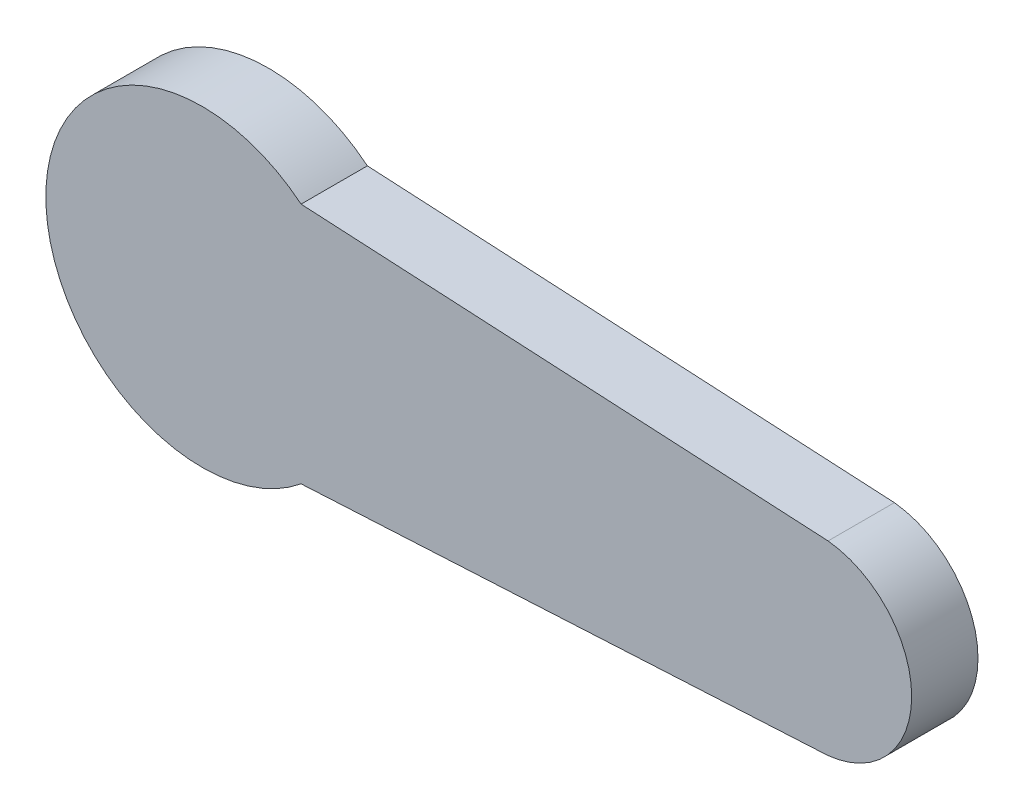
ISO-10303-21;
HEADER;
FILE_DESCRIPTION(('STEP AP214'),'2;1');
FILE_NAME('part.step','',(''),(''),'','','');
FILE_SCHEMA(('AUTOMOTIVE_DESIGN { 1 0 10303 214 1 1 1 1 }'));
ENDSEC;
DATA;
#1=APPLICATION_CONTEXT('core data for automotive mechanical design processes');
#2=APPLICATION_PROTOCOL_DEFINITION('international standard','automotive_design',2000,#1);
#3=PRODUCT_CONTEXT('',#1,'mechanical');
#4=PRODUCT('Part','Part','',(#3));
#5=PRODUCT_RELATED_PRODUCT_CATEGORY('part','',(#4));
#6=PRODUCT_DEFINITION_FORMATION('','',#4);
#7=PRODUCT_DEFINITION_CONTEXT('part definition',#1,'design');
#8=PRODUCT_DEFINITION('design','',#6,#7);
#9=PRODUCT_DEFINITION_SHAPE('','',#8);
#10=(LENGTH_UNIT() NAMED_UNIT(*) SI_UNIT(.MILLI.,.METRE.));
#11=(NAMED_UNIT(*) PLANE_ANGLE_UNIT() SI_UNIT($,.RADIAN.));
#12=(NAMED_UNIT(*) SI_UNIT($,.STERADIAN.) SOLID_ANGLE_UNIT());
#13=UNCERTAINTY_MEASURE_WITH_UNIT(LENGTH_MEASURE(1.E-05),#10,'distance_accuracy_value','');
#14=(GEOMETRIC_REPRESENTATION_CONTEXT(3) GLOBAL_UNCERTAINTY_ASSIGNED_CONTEXT((#13)) GLOBAL_UNIT_ASSIGNED_CONTEXT((#10,
#11,#12)) REPRESENTATION_CONTEXT('',''));
#15=CARTESIAN_POINT('',(0.,0.,0.));
#16=DIRECTION('',(0.,0.,1.));
#17=DIRECTION('',(1.,0.,0.));
#18=AXIS2_PLACEMENT_3D('',#15,#16,#17);
#19=CARTESIAN_POINT('',(5.04999984933762,5.04999993194398,3.5000000949949));
#20=DIRECTION('',(0.,0.,-1.));
#21=DIRECTION('',(-1.,0.,0.));
#22=AXIS2_PLACEMENT_3D('',#19,#20,#21);
#23=CYLINDRICAL_SURFACE('',#22,3.53721114031871);
#24=CARTESIAN_POINT('',(5.04999984933762,5.04999993194398,2.0000000949949));
#25=DIRECTION('',(0.,0.,1.));
#26=DIRECTION('',(1.,0.,0.));
#27=AXIS2_PLACEMENT_3D('',#24,#25,#26);
#28=CIRCLE('',#27,3.53721114031871);
#29=CARTESIAN_POINT('',(7.28690678776681,7.79009299605734,2.0000000949949));
#30=VERTEX_POINT('',#29);
#31=CARTESIAN_POINT('',(7.28690666218476,2.30990676531025,2.0000000949949));
#32=VERTEX_POINT('',#31);
#33=EDGE_CURVE('E102',#30,#32,#28,.T.);
#34=ORIENTED_EDGE('',*,*,#33,.T.);
#35=DIRECTION('',(0.,0.,-1.));
#36=VECTOR('',#35,1.);
#37=CARTESIAN_POINT('',(7.28690666218476,2.30990676531025,3.5000000949949));
#38=LINE('',#37,#36);
#39=CARTESIAN_POINT('',(7.28690666218476,2.30990676531025,3.5000000949949));
#40=VERTEX_POINT('',#39);
#41=EDGE_CURVE('E11',#40,#32,#38,.T.);
#42=ORIENTED_EDGE('',*,*,#41,.F.);
#43=CARTESIAN_POINT('',(5.04999984933762,5.04999993194398,3.5000000949949));
#44=DIRECTION('',(0.,0.,1.));
#45=DIRECTION('',(1.,0.,0.));
#46=AXIS2_PLACEMENT_3D('',#43,#44,#45);
#47=CIRCLE('',#46,3.53721114031871);
#48=CARTESIAN_POINT('',(7.28690678776681,7.79009299605734,3.5000000949949));
#49=VERTEX_POINT('',#48);
#50=EDGE_CURVE('E90',#49,#40,#47,.T.);
#51=ORIENTED_EDGE('',*,*,#50,.F.);
#52=DIRECTION('',(0.,0.,-1.));
#53=VECTOR('',#52,1.);
#54=CARTESIAN_POINT('',(7.28690678776681,7.79009299605734,3.5000000949949));
#55=LINE('',#54,#53);
#56=EDGE_CURVE('E98',#49,#30,#55,.T.);
#57=ORIENTED_EDGE('',*,*,#56,.T.);
#58=EDGE_LOOP('',(#34,#42,#51,#57));
#59=FACE_BOUND('',#58,.T.);
#60=ADVANCED_FACE('F39',(#59),#23,.T.);
#61=CARTESIAN_POINT('',(7.28690666218476,2.30990676531025,3.5000000949949));
#62=DIRECTION('',(-0.0533840275675464,0.998574056142391,0.));
#63=DIRECTION('',(-0.998574056142391,-0.0533840275675464,0.));
#64=AXIS2_PLACEMENT_3D('',#61,#62,#63);
#65=PLANE('',#64);
#66=DIRECTION('',(0.998574056142391,0.0533840275675464,0.));
#67=VECTOR('',#66,1.);
#68=CARTESIAN_POINT('',(7.28690666218476,2.30990676531025,2.0000000949949));
#69=LINE('',#68,#67);
#70=CARTESIAN_POINT('',(19.2084964364767,2.94723804108799,2.0000000949949));
#71=VERTEX_POINT('',#70);
#72=EDGE_CURVE('E94',#32,#71,#69,.T.);
#73=ORIENTED_EDGE('',*,*,#72,.T.);
#74=DIRECTION('',(0.,0.,-1.));
#75=VECTOR('',#74,1.);
#76=CARTESIAN_POINT('',(19.2084964364767,2.94723804108799,3.5000000949949));
#77=LINE('',#76,#75);
#78=CARTESIAN_POINT('',(19.2084964364767,2.94723804108799,3.5000000949949));
#79=VERTEX_POINT('',#78);
#80=EDGE_CURVE('E47',#79,#71,#77,.T.);
#81=ORIENTED_EDGE('',*,*,#80,.F.);
#82=DIRECTION('',(0.998574056142391,0.0533840275675464,0.));
#83=VECTOR('',#82,1.);
#84=CARTESIAN_POINT('',(7.28690666218476,2.30990676531025,3.5000000949949));
#85=LINE('',#84,#83);
#86=EDGE_CURVE('E85',#40,#79,#85,.T.);
#87=ORIENTED_EDGE('',*,*,#86,.F.);
#88=ORIENTED_EDGE('',*,*,#41,.T.);
#89=EDGE_LOOP('',(#73,#81,#87,#88));
#90=FACE_BOUND('',#89,.T.);
#91=ADVANCED_FACE('F93',(#90),#65,.F.);
#92=CARTESIAN_POINT('',(18.9854403608035,5.04999968688935,3.5000000949949));
#93=DIRECTION('',(0.,0.,-1.));
#94=DIRECTION('',(-1.,0.,0.));
#95=AXIS2_PLACEMENT_3D('',#92,#93,#94);
#96=CYLINDRICAL_SURFACE('',#95,2.11455918620123);
#97=CARTESIAN_POINT('',(18.9854403608035,5.04999968688935,2.0000000949949));
#98=DIRECTION('',(0.,0.,1.));
#99=DIRECTION('',(-1.,0.,0.));
#100=AXIS2_PLACEMENT_3D('',#97,#98,#99);
#101=CIRCLE('',#100,2.11455918620123);
#102=CARTESIAN_POINT('',(19.2084964364767,7.15276133269072,2.0000000949949));
#103=VERTEX_POINT('',#102);
#104=EDGE_CURVE('E72',#71,#103,#101,.T.);
#105=ORIENTED_EDGE('',*,*,#104,.T.);
#106=DIRECTION('',(0.,0.,-1.));
#107=VECTOR('',#106,1.);
#108=CARTESIAN_POINT('',(19.2084964364767,7.15276133269072,3.5000000949949));
#109=LINE('',#108,#107);
#110=CARTESIAN_POINT('',(19.2084964364767,7.15276133269072,3.5000000949949));
#111=VERTEX_POINT('',#110);
#112=EDGE_CURVE('E95',#111,#103,#109,.T.);
#113=ORIENTED_EDGE('',*,*,#112,.F.);
#114=CARTESIAN_POINT('',(18.9854403608035,5.04999968688935,3.5000000949949));
#115=DIRECTION('',(0.,0.,1.));
#116=DIRECTION('',(-1.,0.,0.));
#117=AXIS2_PLACEMENT_3D('',#114,#115,#116);
#118=CIRCLE('',#117,2.11455918620123);
#119=EDGE_CURVE('E88',#79,#111,#118,.T.);
#120=ORIENTED_EDGE('',*,*,#119,.F.);
#121=ORIENTED_EDGE('',*,*,#80,.T.);
#122=EDGE_LOOP('',(#105,#113,#120,#121));
#123=FACE_BOUND('',#122,.T.);
#124=ADVANCED_FACE('F96',(#123),#96,.T.);
#125=CARTESIAN_POINT('',(7.28690678776681,7.79009299605734,3.5000000949949));
#126=DIRECTION('',(-0.0533840605009208,-0.998574054381764,0.));
#127=DIRECTION('',(0.998574054381764,-0.0533840605009209,0.));
#128=AXIS2_PLACEMENT_3D('',#125,#126,#127);
#129=PLANE('',#128);
#130=DIRECTION('',(-0.998574054381764,0.0533840605009209,0.));
#131=VECTOR('',#130,1.);
#132=CARTESIAN_POINT('',(7.28690678776681,7.79009299605734,2.0000000949949));
#133=LINE('',#132,#131);
#134=EDGE_CURVE('E78',#103,#30,#133,.T.);
#135=ORIENTED_EDGE('',*,*,#134,.T.);
#136=ORIENTED_EDGE('',*,*,#56,.F.);
#137=DIRECTION('',(-0.998574054381764,0.0533840605009209,0.));
#138=VECTOR('',#137,1.);
#139=CARTESIAN_POINT('',(7.28690678776681,7.79009299605734,3.5000000949949));
#140=LINE('',#139,#138);
#141=EDGE_CURVE('E55',#111,#49,#140,.T.);
#142=ORIENTED_EDGE('',*,*,#141,.F.);
#143=ORIENTED_EDGE('',*,*,#112,.T.);
#144=EDGE_LOOP('',(#135,#136,#142,#143));
#145=FACE_BOUND('',#144,.T.);
#146=ADVANCED_FACE('F109',(#145),#129,.F.);
#147=CARTESIAN_POINT('',(5.04999984933762,5.04999993194398,3.5000000949949));
#148=DIRECTION('',(0.,0.,1.));
#149=DIRECTION('',(1.,0.,0.));
#150=AXIS2_PLACEMENT_3D('',#147,#148,#149);
#151=PLANE('',#150);
#152=ORIENTED_EDGE('',*,*,#50,.T.);
#153=ORIENTED_EDGE('',*,*,#86,.T.);
#154=ORIENTED_EDGE('',*,*,#119,.T.);
#155=ORIENTED_EDGE('',*,*,#141,.T.);
#156=EDGE_LOOP('',(#152,#153,#154,#155));
#157=FACE_BOUND('',#156,.T.);
#158=ADVANCED_FACE('F86',(#157),#151,.T.);
#159=CARTESIAN_POINT('',(5.04999984933762,5.04999993194398,2.0000000949949));
#160=DIRECTION('',(0.,0.,1.));
#161=DIRECTION('',(1.,0.,0.));
#162=AXIS2_PLACEMENT_3D('',#159,#160,#161);
#163=PLANE('',#162);
#164=ORIENTED_EDGE('',*,*,#33,.F.);
#165=ORIENTED_EDGE('',*,*,#134,.F.);
#166=ORIENTED_EDGE('',*,*,#104,.F.);
#167=ORIENTED_EDGE('',*,*,#72,.F.);
#168=EDGE_LOOP('',(#164,#165,#166,#167));
#169=FACE_BOUND('',#168,.T.);
#170=ADVANCED_FACE('F112',(#169),#163,.F.);
#171=CLOSED_SHELL('',(#60,#91,#124,#146,#158,#170));
#172=MANIFOLD_SOLID_BREP('B2',#171);
#173=ADVANCED_BREP_SHAPE_REPRESENTATION('',(#18,#172),#14);
#174=SHAPE_DEFINITION_REPRESENTATION(#9,#173);
ENDSEC;
END-ISO-10303-21;
